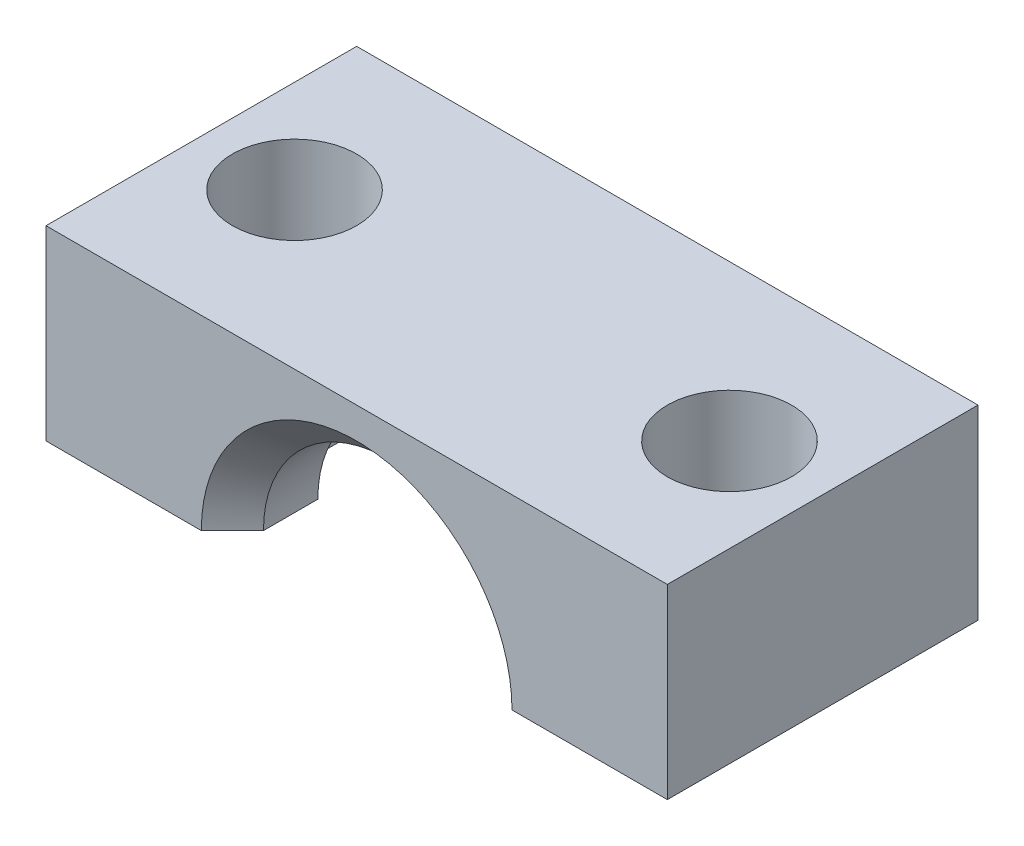
ISO-10303-21;
HEADER;
FILE_DESCRIPTION(('STEP AP214'),'2;1');
FILE_NAME('part.step','',(''),(''),'','','');
FILE_SCHEMA(('AUTOMOTIVE_DESIGN { 1 0 10303 214 1 1 1 1 }'));
ENDSEC;
DATA;
#1=APPLICATION_CONTEXT('core data for automotive mechanical design processes');
#2=APPLICATION_PROTOCOL_DEFINITION('international standard','automotive_design',2000,#1);
#3=PRODUCT_CONTEXT('',#1,'mechanical');
#4=PRODUCT('Part','Part','',(#3));
#5=PRODUCT_RELATED_PRODUCT_CATEGORY('part','',(#4));
#6=PRODUCT_DEFINITION_FORMATION('','',#4);
#7=PRODUCT_DEFINITION_CONTEXT('part definition',#1,'design');
#8=PRODUCT_DEFINITION('design','',#6,#7);
#9=PRODUCT_DEFINITION_SHAPE('','',#8);
#10=(LENGTH_UNIT() NAMED_UNIT(*) SI_UNIT(.MILLI.,.METRE.));
#11=(NAMED_UNIT(*) PLANE_ANGLE_UNIT() SI_UNIT($,.RADIAN.));
#12=(NAMED_UNIT(*) SI_UNIT($,.STERADIAN.) SOLID_ANGLE_UNIT());
#13=UNCERTAINTY_MEASURE_WITH_UNIT(LENGTH_MEASURE(1.E-05),#10,'distance_accuracy_value','');
#14=(GEOMETRIC_REPRESENTATION_CONTEXT(3) GLOBAL_UNCERTAINTY_ASSIGNED_CONTEXT((#13)) GLOBAL_UNIT_ASSIGNED_CONTEXT((#10,
#11,#12)) REPRESENTATION_CONTEXT('',''));
#15=CARTESIAN_POINT('',(0.,0.,0.));
#16=DIRECTION('',(0.,0.,1.));
#17=DIRECTION('',(1.,0.,0.));
#18=AXIS2_PLACEMENT_3D('',#15,#16,#17);
#19=CARTESIAN_POINT('',(-7.,0.,0.));
#20=DIRECTION('',(0.,1.,0.));
#21=DIRECTION('',(0.,0.,1.));
#22=AXIS2_PLACEMENT_3D('',#19,#20,#21);
#23=CYLINDRICAL_SURFACE('',#22,1.2);
#24=CARTESIAN_POINT('',(-7.,0.,0.));
#25=DIRECTION('',(0.,1.,0.));
#26=DIRECTION('',(0.,0.,1.));
#27=AXIS2_PLACEMENT_3D('',#24,#25,#26);
#28=CIRCLE('',#27,1.2);
#29=CARTESIAN_POINT('',(-7.,0.,1.2));
#30=VERTEX_POINT('',#29);
#31=EDGE_CURVE('E146',#30,#30,#28,.T.);
#32=ORIENTED_EDGE('',*,*,#31,.F.);
#33=EDGE_LOOP('',(#32));
#34=FACE_BOUND('',#33,.T.);
#35=CARTESIAN_POINT('',(-7.,2.,0.));
#36=DIRECTION('',(0.,1.,0.));
#37=DIRECTION('',(0.,0.,1.));
#38=AXIS2_PLACEMENT_3D('',#35,#36,#37);
#39=CIRCLE('',#38,1.2);
#40=CARTESIAN_POINT('',(-7.,2.,1.2));
#41=VERTEX_POINT('',#40);
#42=EDGE_CURVE('E40',#41,#41,#39,.F.);
#43=ORIENTED_EDGE('',*,*,#42,.F.);
#44=EDGE_LOOP('',(#43));
#45=FACE_BOUND('',#44,.T.);
#46=ADVANCED_FACE('F36',(#34,#45),#23,.F.);
#47=CARTESIAN_POINT('',(7.,0.,0.));
#48=DIRECTION('',(0.,1.,0.));
#49=DIRECTION('',(0.,0.,1.));
#50=AXIS2_PLACEMENT_3D('',#47,#48,#49);
#51=CYLINDRICAL_SURFACE('',#50,1.2);
#52=CARTESIAN_POINT('',(7.,0.,0.));
#53=DIRECTION('',(0.,1.,0.));
#54=DIRECTION('',(0.,0.,1.));
#55=AXIS2_PLACEMENT_3D('',#52,#53,#54);
#56=CIRCLE('',#55,1.2);
#57=CARTESIAN_POINT('',(7.,0.,1.2));
#58=VERTEX_POINT('',#57);
#59=EDGE_CURVE('E221',#58,#58,#56,.T.);
#60=ORIENTED_EDGE('',*,*,#59,.F.);
#61=EDGE_LOOP('',(#60));
#62=FACE_BOUND('',#61,.T.);
#63=CARTESIAN_POINT('',(7.,2.,0.));
#64=DIRECTION('',(0.,1.,0.));
#65=DIRECTION('',(0.,0.,1.));
#66=AXIS2_PLACEMENT_3D('',#63,#64,#65);
#67=CIRCLE('',#66,1.2);
#68=CARTESIAN_POINT('',(7.,2.,1.2));
#69=VERTEX_POINT('',#68);
#70=EDGE_CURVE('E215',#69,#69,#67,.F.);
#71=ORIENTED_EDGE('',*,*,#70,.F.);
#72=EDGE_LOOP('',(#71));
#73=FACE_BOUND('',#72,.T.);
#74=ADVANCED_FACE('F246',(#62,#73),#51,.F.);
#75=CARTESIAN_POINT('',(-10.,0.,5.));
#76=DIRECTION('',(0.,1.,0.));
#77=DIRECTION('',(-1.,0.,0.));
#78=AXIS2_PLACEMENT_3D('',#75,#76,#77);
#79=PLANE('',#78);
#80=ORIENTED_EDGE('',*,*,#31,.T.);
#81=EDGE_LOOP('',(#80));
#82=FACE_BOUND('',#81,.T.);
#83=DIRECTION('',(1.,0.,0.));
#84=VECTOR('',#83,1.);
#85=CARTESIAN_POINT('',(-10.,0.,-5.));
#86=LINE('',#85,#84);
#87=CARTESIAN_POINT('',(-10.,0.,-5.));
#88=VERTEX_POINT('',#87);
#89=CARTESIAN_POINT('',(-5.,0.,-5.));
#90=VERTEX_POINT('',#89);
#91=EDGE_CURVE('E183',#88,#90,#86,.T.);
#92=ORIENTED_EDGE('',*,*,#91,.T.);
#93=DIRECTION('',(0.707106781186546,0.,0.707106781186549));
#94=VECTOR('',#93,1.);
#95=CARTESIAN_POINT('',(0.,0.,0.));
#96=LINE('',#95,#94);
#97=CARTESIAN_POINT('',(-4.,0.,-3.99999999999999));
#98=VERTEX_POINT('',#97);
#99=EDGE_CURVE('E207',#90,#98,#96,.T.);
#100=ORIENTED_EDGE('',*,*,#99,.T.);
#101=DIRECTION('',(0.,0.,1.));
#102=VECTOR('',#101,1.);
#103=CARTESIAN_POINT('',(-4.,0.,-5.));
#104=LINE('',#103,#102);
#105=CARTESIAN_POINT('',(-4.,0.,-2.25));
#106=VERTEX_POINT('',#105);
#107=EDGE_CURVE('E165',#98,#106,#104,.T.);
#108=ORIENTED_EDGE('',*,*,#107,.T.);
#109=DIRECTION('',(1.,0.,0.));
#110=VECTOR('',#109,1.);
#111=CARTESIAN_POINT('',(-10.,0.,-2.25));
#112=LINE('',#111,#110);
#113=CARTESIAN_POINT('',(-5.25,0.,-2.25));
#114=VERTEX_POINT('',#113);
#115=EDGE_CURVE('E157',#114,#106,#112,.T.);
#116=ORIENTED_EDGE('',*,*,#115,.F.);
#117=DIRECTION('',(0.,0.,1.));
#118=VECTOR('',#117,1.);
#119=CARTESIAN_POINT('',(-5.25,0.,-2.25));
#120=LINE('',#119,#118);
#121=CARTESIAN_POINT('',(-5.25,0.,2.25));
#122=VERTEX_POINT('',#121);
#123=EDGE_CURVE('E160',#114,#122,#120,.T.);
#124=ORIENTED_EDGE('',*,*,#123,.T.);
#125=DIRECTION('',(1.,0.,0.));
#126=VECTOR('',#125,1.);
#127=CARTESIAN_POINT('',(-10.,0.,2.25));
#128=LINE('',#127,#126);
#129=CARTESIAN_POINT('',(-4.,0.,2.25));
#130=VERTEX_POINT('',#129);
#131=EDGE_CURVE('E145',#122,#130,#128,.T.);
#132=ORIENTED_EDGE('',*,*,#131,.T.);
#133=CARTESIAN_POINT('',(-4.,0.,3.99999999999999));
#134=VERTEX_POINT('',#133);
#135=EDGE_CURVE('E164',#130,#134,#104,.T.);
#136=ORIENTED_EDGE('',*,*,#135,.T.);
#137=DIRECTION('',(-0.707106781186549,0.,0.707106781186546));
#138=VECTOR('',#137,1.);
#139=CARTESIAN_POINT('',(0.,0.,0.));
#140=LINE('',#139,#138);
#141=CARTESIAN_POINT('',(-5.00000000000001,0.,5.));
#142=VERTEX_POINT('',#141);
#143=EDGE_CURVE('E205',#134,#142,#140,.T.);
#144=ORIENTED_EDGE('',*,*,#143,.T.);
#145=DIRECTION('',(1.,0.,0.));
#146=VECTOR('',#145,1.);
#147=CARTESIAN_POINT('',(-10.,0.,5.));
#148=LINE('',#147,#146);
#149=CARTESIAN_POINT('',(-10.,0.,5.));
#150=VERTEX_POINT('',#149);
#151=EDGE_CURVE('E173',#150,#142,#148,.T.);
#152=ORIENTED_EDGE('',*,*,#151,.F.);
#153=DIRECTION('',(0.,0.,-1.));
#154=VECTOR('',#153,1.);
#155=CARTESIAN_POINT('',(-10.,0.,5.));
#156=LINE('',#155,#154);
#157=EDGE_CURVE('E197',#150,#88,#156,.T.);
#158=ORIENTED_EDGE('',*,*,#157,.T.);
#159=EDGE_LOOP('',(#92,#100,#108,#116,#124,#132,#136,#144,#152,#158));
#160=FACE_BOUND('',#159,.T.);
#161=ADVANCED_FACE('F241',(#82,#160),#79,.F.);
#162=ORIENTED_EDGE('',*,*,#59,.T.);
#163=EDGE_LOOP('',(#162));
#164=FACE_BOUND('',#163,.T.);
#165=DIRECTION('',(0.,0.,1.));
#166=VECTOR('',#165,1.);
#167=CARTESIAN_POINT('',(4.,0.,-5.));
#168=LINE('',#167,#166);
#169=CARTESIAN_POINT('',(4.,0.,-2.25));
#170=VERTEX_POINT('',#169);
#171=CARTESIAN_POINT('',(4.,0.,-3.99999999999999));
#172=VERTEX_POINT('',#171);
#173=EDGE_CURVE('E162',#170,#172,#168,.F.);
#174=ORIENTED_EDGE('',*,*,#173,.T.);
#175=DIRECTION('',(0.707106781186546,0.,-0.707106781186549));
#176=VECTOR('',#175,1.);
#177=CARTESIAN_POINT('',(0.,0.,0.));
#178=LINE('',#177,#176);
#179=CARTESIAN_POINT('',(5.,0.,-5.));
#180=VERTEX_POINT('',#179);
#181=EDGE_CURVE('E212',#172,#180,#178,.T.);
#182=ORIENTED_EDGE('',*,*,#181,.T.);
#183=CARTESIAN_POINT('',(10.,0.,-5.));
#184=VERTEX_POINT('',#183);
#185=EDGE_CURVE('E182',#180,#184,#86,.T.);
#186=ORIENTED_EDGE('',*,*,#185,.T.);
#187=DIRECTION('',(0.,0.,-1.));
#188=VECTOR('',#187,1.);
#189=CARTESIAN_POINT('',(10.,0.,5.));
#190=LINE('',#189,#188);
#191=CARTESIAN_POINT('',(10.,0.,5.));
#192=VERTEX_POINT('',#191);
#193=EDGE_CURVE('E194',#192,#184,#190,.T.);
#194=ORIENTED_EDGE('',*,*,#193,.F.);
#195=CARTESIAN_POINT('',(5.00000000000001,0.,5.));
#196=VERTEX_POINT('',#195);
#197=EDGE_CURVE('E171',#196,#192,#148,.T.);
#198=ORIENTED_EDGE('',*,*,#197,.F.);
#199=DIRECTION('',(-0.707106781186549,0.,-0.707106781186546));
#200=VECTOR('',#199,1.);
#201=CARTESIAN_POINT('',(0.,0.,0.));
#202=LINE('',#201,#200);
#203=CARTESIAN_POINT('',(4.,0.,3.99999999999999));
#204=VERTEX_POINT('',#203);
#205=EDGE_CURVE('E53',#196,#204,#202,.T.);
#206=ORIENTED_EDGE('',*,*,#205,.T.);
#207=CARTESIAN_POINT('',(4.,0.,2.25));
#208=VERTEX_POINT('',#207);
#209=EDGE_CURVE('E150',#204,#208,#168,.F.);
#210=ORIENTED_EDGE('',*,*,#209,.T.);
#211=DIRECTION('',(1.,0.,0.));
#212=VECTOR('',#211,1.);
#213=CARTESIAN_POINT('',(-10.,0.,2.25));
#214=LINE('',#213,#212);
#215=CARTESIAN_POINT('',(5.25,0.,2.25));
#216=VERTEX_POINT('',#215);
#217=EDGE_CURVE('E142',#208,#216,#214,.T.);
#218=ORIENTED_EDGE('',*,*,#217,.T.);
#219=DIRECTION('',(0.,0.,1.));
#220=VECTOR('',#219,1.);
#221=CARTESIAN_POINT('',(5.25,0.,-2.25));
#222=LINE('',#221,#220);
#223=CARTESIAN_POINT('',(5.25,0.,-2.25));
#224=VERTEX_POINT('',#223);
#225=EDGE_CURVE('E127',#216,#224,#222,.F.);
#226=ORIENTED_EDGE('',*,*,#225,.T.);
#227=DIRECTION('',(1.,0.,0.));
#228=VECTOR('',#227,1.);
#229=CARTESIAN_POINT('',(-10.,0.,-2.25));
#230=LINE('',#229,#228);
#231=EDGE_CURVE('E152',#170,#224,#230,.T.);
#232=ORIENTED_EDGE('',*,*,#231,.F.);
#233=EDGE_LOOP('',(#174,#182,#186,#194,#198,#206,#210,#218,#226,#232));
#234=FACE_BOUND('',#233,.T.);
#235=ADVANCED_FACE('F149',(#164,#234),#79,.F.);
#236=CARTESIAN_POINT('',(0.,0.,-5.));
#237=DIRECTION('',(0.,0.,1.));
#238=DIRECTION('',(1.,0.,0.));
#239=AXIS2_PLACEMENT_3D('',#236,#237,#238);
#240=CYLINDRICAL_SURFACE('',#239,4.);
#241=ORIENTED_EDGE('',*,*,#107,.F.);
#242=CARTESIAN_POINT('',(0.,0.,-3.99999999999999));
#243=DIRECTION('',(0.,0.,-1.));
#244=DIRECTION('',(-1.,0.,0.));
#245=AXIS2_PLACEMENT_3D('',#242,#243,#244);
#246=CIRCLE('',#245,4.);
#247=EDGE_CURVE('E209',#98,#172,#246,.T.);
#248=ORIENTED_EDGE('',*,*,#247,.T.);
#249=ORIENTED_EDGE('',*,*,#173,.F.);
#250=CARTESIAN_POINT('',(0.,0.,-2.25));
#251=DIRECTION('',(0.,0.,1.));
#252=DIRECTION('',(1.,0.,0.));
#253=AXIS2_PLACEMENT_3D('',#250,#251,#252);
#254=CIRCLE('',#253,4.);
#255=EDGE_CURVE('E137',#106,#170,#254,.F.);
#256=ORIENTED_EDGE('',*,*,#255,.F.);
#257=EDGE_LOOP('',(#241,#248,#249,#256));
#258=FACE_BOUND('',#257,.T.);
#259=ADVANCED_FACE('F285',(#258),#240,.F.);
#260=CARTESIAN_POINT('',(-10.,0.,5.));
#261=DIRECTION('',(1.,0.,0.));
#262=DIRECTION('',(0.,0.,-1.));
#263=AXIS2_PLACEMENT_3D('',#260,#261,#262);
#264=PLANE('',#263);
#265=DIRECTION('',(0.,-1.,0.));
#266=VECTOR('',#265,1.);
#267=CARTESIAN_POINT('',(-10.,0.,-5.));
#268=LINE('',#267,#266);
#269=CARTESIAN_POINT('',(-10.,6.,-5.));
#270=VERTEX_POINT('',#269);
#271=EDGE_CURVE('E167',#270,#88,#268,.T.);
#272=ORIENTED_EDGE('',*,*,#271,.T.);
#273=ORIENTED_EDGE('',*,*,#157,.F.);
#274=DIRECTION('',(0.,-1.,0.));
#275=VECTOR('',#274,1.);
#276=CARTESIAN_POINT('',(-10.,0.,5.));
#277=LINE('',#276,#275);
#278=CARTESIAN_POINT('',(-10.,6.,5.));
#279=VERTEX_POINT('',#278);
#280=EDGE_CURVE('E168',#279,#150,#277,.T.);
#281=ORIENTED_EDGE('',*,*,#280,.F.);
#282=DIRECTION('',(0.,0.,-1.));
#283=VECTOR('',#282,1.);
#284=CARTESIAN_POINT('',(-10.,6.,5.));
#285=LINE('',#284,#283);
#286=EDGE_CURVE('E179',#279,#270,#285,.T.);
#287=ORIENTED_EDGE('',*,*,#286,.T.);
#288=EDGE_LOOP('',(#272,#273,#281,#287));
#289=FACE_BOUND('',#288,.T.);
#290=ADVANCED_FACE('F299',(#289),#264,.F.);
#291=CARTESIAN_POINT('',(10.,0.,5.));
#292=DIRECTION('',(-1.,0.,0.));
#293=DIRECTION('',(0.,0.,1.));
#294=AXIS2_PLACEMENT_3D('',#291,#292,#293);
#295=PLANE('',#294);
#296=DIRECTION('',(0.,1.,0.));
#297=VECTOR('',#296,1.);
#298=CARTESIAN_POINT('',(10.,0.,-5.));
#299=LINE('',#298,#297);
#300=CARTESIAN_POINT('',(10.,6.,-5.));
#301=VERTEX_POINT('',#300);
#302=EDGE_CURVE('E186',#184,#301,#299,.T.);
#303=ORIENTED_EDGE('',*,*,#302,.T.);
#304=DIRECTION('',(0.,0.,-1.));
#305=VECTOR('',#304,1.);
#306=CARTESIAN_POINT('',(10.,6.,5.));
#307=LINE('',#306,#305);
#308=CARTESIAN_POINT('',(10.,6.,5.));
#309=VERTEX_POINT('',#308);
#310=EDGE_CURVE('E191',#309,#301,#307,.T.);
#311=ORIENTED_EDGE('',*,*,#310,.F.);
#312=DIRECTION('',(0.,1.,0.));
#313=VECTOR('',#312,1.);
#314=CARTESIAN_POINT('',(10.,0.,5.));
#315=LINE('',#314,#313);
#316=EDGE_CURVE('E175',#192,#309,#315,.T.);
#317=ORIENTED_EDGE('',*,*,#316,.F.);
#318=ORIENTED_EDGE('',*,*,#193,.T.);
#319=EDGE_LOOP('',(#303,#311,#317,#318));
#320=FACE_BOUND('',#319,.T.);
#321=ADVANCED_FACE('F295',(#320),#295,.F.);
#322=CARTESIAN_POINT('',(-10.,6.,5.));
#323=DIRECTION('',(0.,-1.,0.));
#324=DIRECTION('',(0.,0.,-1.));
#325=AXIS2_PLACEMENT_3D('',#322,#323,#324);
#326=PLANE('',#325);
#327=CARTESIAN_POINT('',(-7.,6.,0.));
#328=DIRECTION('',(0.,1.,0.));
#329=DIRECTION('',(0.,0.,1.));
#330=AXIS2_PLACEMENT_3D('',#327,#328,#329);
#331=CIRCLE('',#330,2.);
#332=CARTESIAN_POINT('',(-7.,6.,2.));
#333=VERTEX_POINT('',#332);
#334=EDGE_CURVE('E223',#333,#333,#331,.T.);
#335=ORIENTED_EDGE('',*,*,#334,.F.);
#336=EDGE_LOOP('',(#335));
#337=FACE_BOUND('',#336,.T.);
#338=CARTESIAN_POINT('',(7.,6.,0.));
#339=DIRECTION('',(0.,1.,0.));
#340=DIRECTION('',(0.,0.,1.));
#341=AXIS2_PLACEMENT_3D('',#338,#339,#340);
#342=CIRCLE('',#341,2.);
#343=CARTESIAN_POINT('',(7.,6.,2.));
#344=VERTEX_POINT('',#343);
#345=EDGE_CURVE('E233',#344,#344,#342,.T.);
#346=ORIENTED_EDGE('',*,*,#345,.F.);
#347=EDGE_LOOP('',(#346));
#348=FACE_BOUND('',#347,.T.);
#349=DIRECTION('',(-1.,0.,0.));
#350=VECTOR('',#349,1.);
#351=CARTESIAN_POINT('',(-10.,6.,-5.));
#352=LINE('',#351,#350);
#353=EDGE_CURVE('E172',#301,#270,#352,.T.);
#354=ORIENTED_EDGE('',*,*,#353,.T.);
#355=ORIENTED_EDGE('',*,*,#286,.F.);
#356=DIRECTION('',(-1.,0.,0.));
#357=VECTOR('',#356,1.);
#358=CARTESIAN_POINT('',(-10.,6.,5.));
#359=LINE('',#358,#357);
#360=EDGE_CURVE('E177',#309,#279,#359,.T.);
#361=ORIENTED_EDGE('',*,*,#360,.F.);
#362=ORIENTED_EDGE('',*,*,#310,.T.);
#363=EDGE_LOOP('',(#354,#355,#361,#362));
#364=FACE_BOUND('',#363,.T.);
#365=ADVANCED_FACE('F289',(#337,#348,#364),#326,.F.);
#366=CARTESIAN_POINT('',(0.,0.,5.));
#367=DIRECTION('',(0.,0.,-1.));
#368=DIRECTION('',(-1.,0.,0.));
#369=AXIS2_PLACEMENT_3D('',#366,#367,#368);
#370=PLANE('',#369);
#371=ORIENTED_EDGE('',*,*,#151,.T.);
#372=CARTESIAN_POINT('',(0.,0.,5.));
#373=DIRECTION('',(0.,0.,-1.));
#374=DIRECTION('',(-1.,0.,0.));
#375=AXIS2_PLACEMENT_3D('',#372,#373,#374);
#376=CIRCLE('',#375,5.00000000000001);
#377=EDGE_CURVE('E11',#142,#196,#376,.T.);
#378=ORIENTED_EDGE('',*,*,#377,.T.);
#379=ORIENTED_EDGE('',*,*,#197,.T.);
#380=ORIENTED_EDGE('',*,*,#316,.T.);
#381=ORIENTED_EDGE('',*,*,#360,.T.);
#382=ORIENTED_EDGE('',*,*,#280,.T.);
#383=EDGE_LOOP('',(#371,#378,#379,#380,#381,#382));
#384=FACE_BOUND('',#383,.T.);
#385=ADVANCED_FACE('F286',(#384),#370,.F.);
#386=CARTESIAN_POINT('',(0.,0.,-5.));
#387=DIRECTION('',(0.,0.,-1.));
#388=DIRECTION('',(-1.,0.,0.));
#389=AXIS2_PLACEMENT_3D('',#386,#387,#388);
#390=PLANE('',#389);
#391=ORIENTED_EDGE('',*,*,#185,.F.);
#392=CARTESIAN_POINT('',(0.,0.,-5.));
#393=DIRECTION('',(0.,0.,-1.));
#394=DIRECTION('',(-1.,0.,0.));
#395=AXIS2_PLACEMENT_3D('',#392,#393,#394);
#396=CIRCLE('',#395,5.);
#397=EDGE_CURVE('E136',#180,#90,#396,.F.);
#398=ORIENTED_EDGE('',*,*,#397,.T.);
#399=ORIENTED_EDGE('',*,*,#91,.F.);
#400=ORIENTED_EDGE('',*,*,#271,.F.);
#401=ORIENTED_EDGE('',*,*,#353,.F.);
#402=ORIENTED_EDGE('',*,*,#302,.F.);
#403=EDGE_LOOP('',(#391,#398,#399,#400,#401,#402));
#404=FACE_BOUND('',#403,.T.);
#405=ADVANCED_FACE('F283',(#404),#390,.T.);
#406=ORIENTED_EDGE('',*,*,#209,.F.);
#407=CARTESIAN_POINT('',(0.,0.,3.99999999999999));
#408=DIRECTION('',(0.,0.,-1.));
#409=DIRECTION('',(-1.,0.,0.));
#410=AXIS2_PLACEMENT_3D('',#407,#408,#409);
#411=CIRCLE('',#410,4.);
#412=EDGE_CURVE('E45',#204,#134,#411,.F.);
#413=ORIENTED_EDGE('',*,*,#412,.T.);
#414=ORIENTED_EDGE('',*,*,#135,.F.);
#415=CARTESIAN_POINT('',(0.,0.,2.25));
#416=DIRECTION('',(0.,0.,1.));
#417=DIRECTION('',(1.,0.,0.));
#418=AXIS2_PLACEMENT_3D('',#415,#416,#417);
#419=CIRCLE('',#418,4.);
#420=EDGE_CURVE('E200',#130,#208,#419,.F.);
#421=ORIENTED_EDGE('',*,*,#420,.T.);
#422=EDGE_LOOP('',(#406,#413,#414,#421));
#423=FACE_BOUND('',#422,.T.);
#424=ADVANCED_FACE('F280',(#423),#240,.F.);
#425=CARTESIAN_POINT('',(0.,0.,-2.25));
#426=DIRECTION('',(0.,0.,1.));
#427=DIRECTION('',(1.,0.,0.));
#428=AXIS2_PLACEMENT_3D('',#425,#426,#427);
#429=CYLINDRICAL_SURFACE('',#428,5.25);
#430=CARTESIAN_POINT('',(0.,0.,-2.25));
#431=DIRECTION('',(0.,0.,1.));
#432=DIRECTION('',(1.,0.,0.));
#433=AXIS2_PLACEMENT_3D('',#430,#431,#432);
#434=CIRCLE('',#433,5.25);
#435=EDGE_CURVE('E133',#224,#114,#434,.T.);
#436=ORIENTED_EDGE('',*,*,#435,.F.);
#437=ORIENTED_EDGE('',*,*,#225,.F.);
#438=CARTESIAN_POINT('',(0.,0.,2.25));
#439=DIRECTION('',(0.,0.,1.));
#440=DIRECTION('',(1.,0.,0.));
#441=AXIS2_PLACEMENT_3D('',#438,#439,#440);
#442=CIRCLE('',#441,5.25);
#443=EDGE_CURVE('E130',#216,#122,#442,.T.);
#444=ORIENTED_EDGE('',*,*,#443,.T.);
#445=ORIENTED_EDGE('',*,*,#123,.F.);
#446=EDGE_LOOP('',(#436,#437,#444,#445));
#447=FACE_BOUND('',#446,.T.);
#448=ADVANCED_FACE('F129',(#447),#429,.F.);
#449=CARTESIAN_POINT('',(0.,0.,-2.25));
#450=DIRECTION('',(0.,0.,1.));
#451=DIRECTION('',(1.,0.,0.));
#452=AXIS2_PLACEMENT_3D('',#449,#450,#451);
#453=PLANE('',#452);
#454=ORIENTED_EDGE('',*,*,#115,.T.);
#455=ORIENTED_EDGE('',*,*,#255,.T.);
#456=ORIENTED_EDGE('',*,*,#231,.T.);
#457=ORIENTED_EDGE('',*,*,#435,.T.);
#458=EDGE_LOOP('',(#454,#455,#456,#457));
#459=FACE_BOUND('',#458,.T.);
#460=ADVANCED_FACE('F271',(#459),#453,.T.);
#461=CARTESIAN_POINT('',(0.,0.,2.25));
#462=DIRECTION('',(0.,0.,1.));
#463=DIRECTION('',(1.,0.,0.));
#464=AXIS2_PLACEMENT_3D('',#461,#462,#463);
#465=PLANE('',#464);
#466=ORIENTED_EDGE('',*,*,#443,.F.);
#467=ORIENTED_EDGE('',*,*,#217,.F.);
#468=ORIENTED_EDGE('',*,*,#420,.F.);
#469=ORIENTED_EDGE('',*,*,#131,.F.);
#470=EDGE_LOOP('',(#466,#467,#468,#469));
#471=FACE_BOUND('',#470,.T.);
#472=ADVANCED_FACE('F141',(#471),#465,.F.);
#473=CARTESIAN_POINT('',(0.,0.,-5.));
#474=DIRECTION('',(0.,0.,-1.));
#475=DIRECTION('',(-1.,0.,0.));
#476=AXIS2_PLACEMENT_3D('',#473,#474,#475);
#477=CONICAL_SURFACE('',#476,5.,0.785398163397447);
#478=ORIENTED_EDGE('',*,*,#181,.F.);
#479=ORIENTED_EDGE('',*,*,#247,.F.);
#480=ORIENTED_EDGE('',*,*,#99,.F.);
#481=ORIENTED_EDGE('',*,*,#397,.F.);
#482=EDGE_LOOP('',(#478,#479,#480,#481));
#483=FACE_BOUND('',#482,.T.);
#484=ADVANCED_FACE('F277',(#483),#477,.F.);
#485=CARTESIAN_POINT('',(0.,0.,3.99999999999999));
#486=DIRECTION('',(0.,0.,1.));
#487=DIRECTION('',(1.,0.,0.));
#488=AXIS2_PLACEMENT_3D('',#485,#486,#487);
#489=CONICAL_SURFACE('',#488,4.,0.78539816339745);
#490=ORIENTED_EDGE('',*,*,#205,.F.);
#491=ORIENTED_EDGE('',*,*,#377,.F.);
#492=ORIENTED_EDGE('',*,*,#143,.F.);
#493=ORIENTED_EDGE('',*,*,#412,.F.);
#494=EDGE_LOOP('',(#490,#491,#492,#493));
#495=FACE_BOUND('',#494,.T.);
#496=ADVANCED_FACE('F38',(#495),#489,.F.);
#497=CARTESIAN_POINT('',(7.,2.,0.));
#498=DIRECTION('',(0.,1.,0.));
#499=DIRECTION('',(0.,0.,1.));
#500=AXIS2_PLACEMENT_3D('',#497,#498,#499);
#501=PLANE('',#500);
#502=CARTESIAN_POINT('',(7.,2.,0.));
#503=DIRECTION('',(0.,1.,0.));
#504=DIRECTION('',(0.,0.,1.));
#505=AXIS2_PLACEMENT_3D('',#502,#503,#504);
#506=CIRCLE('',#505,2.);
#507=CARTESIAN_POINT('',(7.,2.,2.));
#508=VERTEX_POINT('',#507);
#509=EDGE_CURVE('E228',#508,#508,#506,.T.);
#510=ORIENTED_EDGE('',*,*,#509,.T.);
#511=EDGE_LOOP('',(#510));
#512=FACE_BOUND('',#511,.T.);
#513=ORIENTED_EDGE('',*,*,#70,.T.);
#514=EDGE_LOOP('',(#513));
#515=FACE_BOUND('',#514,.T.);
#516=ADVANCED_FACE('F261',(#512,#515),#501,.T.);
#517=CARTESIAN_POINT('',(7.,2.,0.));
#518=DIRECTION('',(0.,1.,0.));
#519=DIRECTION('',(0.,0.,1.));
#520=AXIS2_PLACEMENT_3D('',#517,#518,#519);
#521=CYLINDRICAL_SURFACE('',#520,2.);
#522=ORIENTED_EDGE('',*,*,#509,.F.);
#523=EDGE_LOOP('',(#522));
#524=FACE_BOUND('',#523,.T.);
#525=ORIENTED_EDGE('',*,*,#345,.T.);
#526=EDGE_LOOP('',(#525));
#527=FACE_BOUND('',#526,.T.);
#528=ADVANCED_FACE('F253',(#524,#527),#521,.F.);
#529=CARTESIAN_POINT('',(-7.,2.,0.));
#530=DIRECTION('',(0.,1.,0.));
#531=DIRECTION('',(0.,0.,1.));
#532=AXIS2_PLACEMENT_3D('',#529,#530,#531);
#533=PLANE('',#532);
#534=CARTESIAN_POINT('',(-7.,2.,0.));
#535=DIRECTION('',(0.,1.,0.));
#536=DIRECTION('',(0.,0.,1.));
#537=AXIS2_PLACEMENT_3D('',#534,#535,#536);
#538=CIRCLE('',#537,2.);
#539=CARTESIAN_POINT('',(-7.,2.,2.));
#540=VERTEX_POINT('',#539);
#541=EDGE_CURVE('E217',#540,#540,#538,.T.);
#542=ORIENTED_EDGE('',*,*,#541,.T.);
#543=EDGE_LOOP('',(#542));
#544=FACE_BOUND('',#543,.T.);
#545=ORIENTED_EDGE('',*,*,#42,.T.);
#546=EDGE_LOOP('',(#545));
#547=FACE_BOUND('',#546,.T.);
#548=ADVANCED_FACE('F250',(#544,#547),#533,.T.);
#549=CARTESIAN_POINT('',(-7.,2.,0.));
#550=DIRECTION('',(0.,1.,0.));
#551=DIRECTION('',(0.,0.,1.));
#552=AXIS2_PLACEMENT_3D('',#549,#550,#551);
#553=CYLINDRICAL_SURFACE('',#552,2.);
#554=ORIENTED_EDGE('',*,*,#541,.F.);
#555=EDGE_LOOP('',(#554));
#556=FACE_BOUND('',#555,.T.);
#557=ORIENTED_EDGE('',*,*,#334,.T.);
#558=EDGE_LOOP('',(#557));
#559=FACE_BOUND('',#558,.T.);
#560=ADVANCED_FACE('F252',(#556,#559),#553,.F.);
#561=CLOSED_SHELL('',(#46,#74,#161,#235,#259,#290,#321,#365,#385,#405,#424,#448,#460,#472,#484,
#496,#516,#528,#548,#560));
#562=MANIFOLD_SOLID_BREP('B2',#561);
#563=ADVANCED_BREP_SHAPE_REPRESENTATION('',(#18,#562),#14);
#564=SHAPE_DEFINITION_REPRESENTATION(#9,#563);
ENDSEC;
END-ISO-10303-21;
